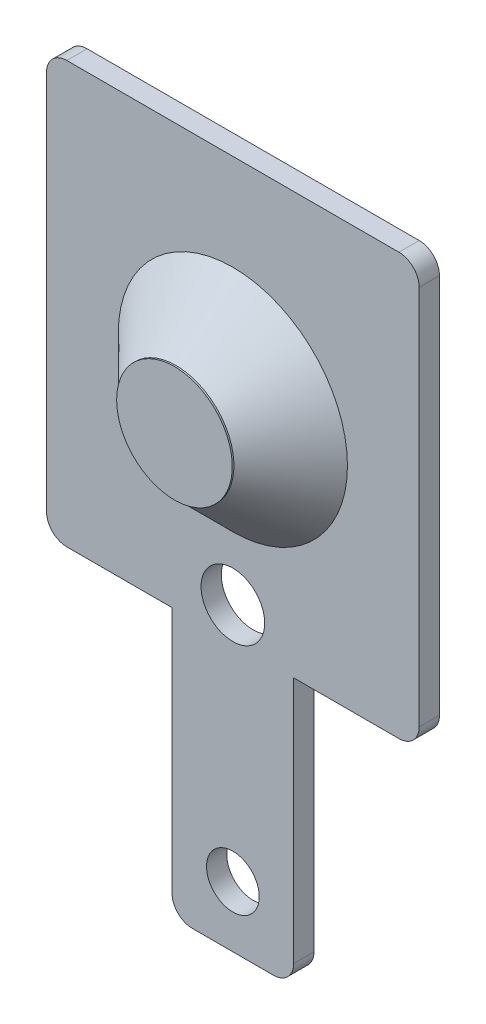
ISO-10303-21;
HEADER;
FILE_DESCRIPTION(('STEP AP214'),'2;1');
FILE_NAME('part.step','',(''),(''),'','','');
FILE_SCHEMA(('AUTOMOTIVE_DESIGN { 1 0 10303 214 1 1 1 1 }'));
ENDSEC;
DATA;
#1=APPLICATION_CONTEXT('core data for automotive mechanical design processes');
#2=APPLICATION_PROTOCOL_DEFINITION('international standard','automotive_design',2000,#1);
#3=PRODUCT_CONTEXT('',#1,'mechanical');
#4=PRODUCT('Part','Part','',(#3));
#5=PRODUCT_RELATED_PRODUCT_CATEGORY('part','',(#4));
#6=PRODUCT_DEFINITION_FORMATION('','',#4);
#7=PRODUCT_DEFINITION_CONTEXT('part definition',#1,'design');
#8=PRODUCT_DEFINITION('design','',#6,#7);
#9=PRODUCT_DEFINITION_SHAPE('','',#8);
#10=(LENGTH_UNIT() NAMED_UNIT(*) SI_UNIT(.MILLI.,.METRE.));
#11=(NAMED_UNIT(*) PLANE_ANGLE_UNIT() SI_UNIT($,.RADIAN.));
#12=(NAMED_UNIT(*) SI_UNIT($,.STERADIAN.) SOLID_ANGLE_UNIT());
#13=UNCERTAINTY_MEASURE_WITH_UNIT(LENGTH_MEASURE(1.E-05),#10,'distance_accuracy_value','');
#14=(GEOMETRIC_REPRESENTATION_CONTEXT(3) GLOBAL_UNCERTAINTY_ASSIGNED_CONTEXT((#13)) GLOBAL_UNIT_ASSIGNED_CONTEXT((#10,
#11,#12)) REPRESENTATION_CONTEXT('',''));
#15=CARTESIAN_POINT('',(0.,0.,0.));
#16=DIRECTION('',(0.,0.,1.));
#17=DIRECTION('',(1.,0.,0.));
#18=AXIS2_PLACEMENT_3D('',#15,#16,#17);
#19=CARTESIAN_POINT('',(0.,0.,0.5));
#20=DIRECTION('',(0.,0.,-1.));
#21=DIRECTION('',(-1.,0.,0.));
#22=AXIS2_PLACEMENT_3D('',#19,#20,#21);
#23=PLANE('',#22);
#24=CARTESIAN_POINT('',(4.595,-5.1943,0.5));
#25=DIRECTION('',(0.,0.,-1.));
#26=DIRECTION('',(-1.,0.,0.));
#27=AXIS2_PLACEMENT_3D('',#24,#25,#26);
#28=CIRCLE('',#27,2.82620679675844);
#29=CARTESIAN_POINT('',(1.76879320324156,-5.1943,0.5));
#30=VERTEX_POINT('',#29);
#31=EDGE_CURVE('E11',#30,#30,#28,.T.);
#32=ORIENTED_EDGE('',*,*,#31,.T.);
#33=EDGE_LOOP('',(#32));
#34=FACE_BOUND('',#33,.T.);
#35=DIRECTION('',(1.,0.,0.));
#36=VECTOR('',#35,1.);
#37=CARTESIAN_POINT('',(6.095,-10.3886,0.5));
#38=LINE('',#37,#36);
#39=CARTESIAN_POINT('',(6.095,-10.3886,0.5));
#40=VERTEX_POINT('',#39);
#41=CARTESIAN_POINT('',(8.69,-10.3886,0.5));
#42=VERTEX_POINT('',#41);
#43=EDGE_CURVE('E174',#40,#42,#38,.T.);
#44=ORIENTED_EDGE('',*,*,#43,.T.);
#45=CARTESIAN_POINT('',(8.69,-9.8886,0.5));
#46=DIRECTION('',(0.,0.,-1.));
#47=DIRECTION('',(-1.,0.,0.));
#48=AXIS2_PLACEMENT_3D('',#45,#46,#47);
#49=CIRCLE('',#48,0.5);
#50=CARTESIAN_POINT('',(9.19,-9.88859999999999,0.5));
#51=VERTEX_POINT('',#50);
#52=EDGE_CURVE('E228',#42,#51,#49,.F.);
#53=ORIENTED_EDGE('',*,*,#52,.T.);
#54=DIRECTION('',(0.,1.,0.));
#55=VECTOR('',#54,1.);
#56=CARTESIAN_POINT('',(9.19,0.,0.5));
#57=LINE('',#56,#55);
#58=CARTESIAN_POINT('',(9.19,-0.5,0.5));
#59=VERTEX_POINT('',#58);
#60=EDGE_CURVE('E176',#51,#59,#57,.T.);
#61=ORIENTED_EDGE('',*,*,#60,.T.);
#62=CARTESIAN_POINT('',(8.69,-0.5,0.5));
#63=DIRECTION('',(0.,0.,-1.));
#64=DIRECTION('',(-1.,0.,0.));
#65=AXIS2_PLACEMENT_3D('',#62,#63,#64);
#66=CIRCLE('',#65,0.5);
#67=CARTESIAN_POINT('',(8.69,0.,0.5));
#68=VERTEX_POINT('',#67);
#69=EDGE_CURVE('E57',#59,#68,#66,.F.);
#70=ORIENTED_EDGE('',*,*,#69,.T.);
#71=DIRECTION('',(-1.,0.,0.));
#72=VECTOR('',#71,1.);
#73=CARTESIAN_POINT('',(0.,0.,0.5));
#74=LINE('',#73,#72);
#75=CARTESIAN_POINT('',(0.5,0.,0.5));
#76=VERTEX_POINT('',#75);
#77=EDGE_CURVE('E178',#68,#76,#74,.T.);
#78=ORIENTED_EDGE('',*,*,#77,.T.);
#79=CARTESIAN_POINT('',(0.5,-0.5,0.5));
#80=DIRECTION('',(0.,0.,-1.));
#81=DIRECTION('',(-1.,0.,0.));
#82=AXIS2_PLACEMENT_3D('',#79,#80,#81);
#83=CIRCLE('',#82,0.5);
#84=CARTESIAN_POINT('',(0.,-0.500000000000004,0.5));
#85=VERTEX_POINT('',#84);
#86=EDGE_CURVE('E226',#76,#85,#83,.F.);
#87=ORIENTED_EDGE('',*,*,#86,.T.);
#88=DIRECTION('',(0.,-1.,0.));
#89=VECTOR('',#88,1.);
#90=CARTESIAN_POINT('',(0.,-10.3886,0.5));
#91=LINE('',#90,#89);
#92=CARTESIAN_POINT('',(0.,-9.8886,0.5));
#93=VERTEX_POINT('',#92);
#94=EDGE_CURVE('E150',#85,#93,#91,.T.);
#95=ORIENTED_EDGE('',*,*,#94,.T.);
#96=CARTESIAN_POINT('',(0.5,-9.8886,0.5));
#97=DIRECTION('',(0.,0.,-1.));
#98=DIRECTION('',(-1.,0.,0.));
#99=AXIS2_PLACEMENT_3D('',#96,#97,#98);
#100=CIRCLE('',#99,0.5);
#101=CARTESIAN_POINT('',(0.5,-10.3886,0.5));
#102=VERTEX_POINT('',#101);
#103=EDGE_CURVE('E146',#93,#102,#100,.F.);
#104=ORIENTED_EDGE('',*,*,#103,.T.);
#105=DIRECTION('',(1.,0.,0.));
#106=VECTOR('',#105,1.);
#107=CARTESIAN_POINT('',(0.,-10.3886,0.5));
#108=LINE('',#107,#106);
#109=CARTESIAN_POINT('',(3.095,-10.3886,0.5));
#110=VERTEX_POINT('',#109);
#111=EDGE_CURVE('E137',#102,#110,#108,.T.);
#112=ORIENTED_EDGE('',*,*,#111,.T.);
#113=DIRECTION('',(0.,-1.,0.));
#114=VECTOR('',#113,1.);
#115=CARTESIAN_POINT('',(3.095,-10.3886,0.5));
#116=LINE('',#115,#114);
#117=CARTESIAN_POINT('',(3.095,-16.49,0.5));
#118=VERTEX_POINT('',#117);
#119=EDGE_CURVE('E142',#110,#118,#116,.T.);
#120=ORIENTED_EDGE('',*,*,#119,.T.);
#121=CARTESIAN_POINT('',(3.595,-16.49,0.5));
#122=DIRECTION('',(0.,0.,-1.));
#123=DIRECTION('',(-1.,0.,0.));
#124=AXIS2_PLACEMENT_3D('',#121,#122,#123);
#125=CIRCLE('',#124,0.5);
#126=CARTESIAN_POINT('',(3.595,-16.99,0.5));
#127=VERTEX_POINT('',#126);
#128=EDGE_CURVE('E221',#118,#127,#125,.F.);
#129=ORIENTED_EDGE('',*,*,#128,.T.);
#130=DIRECTION('',(1.,0.,0.));
#131=VECTOR('',#130,1.);
#132=CARTESIAN_POINT('',(3.095,-16.99,0.5));
#133=LINE('',#132,#131);
#134=CARTESIAN_POINT('',(5.595,-16.99,0.5));
#135=VERTEX_POINT('',#134);
#136=EDGE_CURVE('E166',#127,#135,#133,.T.);
#137=ORIENTED_EDGE('',*,*,#136,.T.);
#138=CARTESIAN_POINT('',(5.595,-16.49,0.5));
#139=DIRECTION('',(0.,0.,-1.));
#140=DIRECTION('',(-1.,0.,0.));
#141=AXIS2_PLACEMENT_3D('',#138,#139,#140);
#142=CIRCLE('',#141,0.5);
#143=CARTESIAN_POINT('',(6.095,-16.49,0.5));
#144=VERTEX_POINT('',#143);
#145=EDGE_CURVE('E223',#135,#144,#142,.F.);
#146=ORIENTED_EDGE('',*,*,#145,.T.);
#147=DIRECTION('',(0.,1.,0.));
#148=VECTOR('',#147,1.);
#149=CARTESIAN_POINT('',(6.095,-16.99,0.5));
#150=LINE('',#149,#148);
#151=EDGE_CURVE('E169',#144,#40,#150,.T.);
#152=ORIENTED_EDGE('',*,*,#151,.T.);
#153=EDGE_LOOP('',(#44,#53,#61,#70,#78,#87,#95,#104,#112,#120,#129,#137,#146,#152));
#154=FACE_BOUND('',#153,.T.);
#155=CARTESIAN_POINT('',(4.595,-15.49,0.5));
#156=DIRECTION('',(0.,0.,1.));
#157=DIRECTION('',(1.,0.,0.));
#158=AXIS2_PLACEMENT_3D('',#155,#156,#157);
#159=CIRCLE('',#158,0.65);
#160=CARTESIAN_POINT('',(5.245,-15.49,0.5));
#161=VERTEX_POINT('',#160);
#162=EDGE_CURVE('E183',#161,#161,#159,.T.);
#163=ORIENTED_EDGE('',*,*,#162,.F.);
#164=EDGE_LOOP('',(#163));
#165=FACE_BOUND('',#164,.T.);
#166=CARTESIAN_POINT('',(4.595,-9.5786,0.5));
#167=DIRECTION('',(0.,0.,1.));
#168=DIRECTION('',(1.,0.,0.));
#169=AXIS2_PLACEMENT_3D('',#166,#167,#168);
#170=CIRCLE('',#169,0.784999999999999);
#171=CARTESIAN_POINT('',(5.38,-9.5786,0.5));
#172=VERTEX_POINT('',#171);
#173=EDGE_CURVE('E361',#172,#172,#170,.T.);
#174=ORIENTED_EDGE('',*,*,#173,.F.);
#175=EDGE_LOOP('',(#174));
#176=FACE_BOUND('',#175,.T.);
#177=ADVANCED_FACE('F35',(#34,#154,#165,#176),#23,.F.);
#178=CARTESIAN_POINT('',(0.,0.,0.));
#179=DIRECTION('',(0.,0.,-1.));
#180=DIRECTION('',(-1.,0.,0.));
#181=AXIS2_PLACEMENT_3D('',#178,#179,#180);
#182=PLANE('',#181);
#183=CARTESIAN_POINT('',(4.595,-15.49,0.));
#184=DIRECTION('',(0.,0.,1.));
#185=DIRECTION('',(1.,0.,0.));
#186=AXIS2_PLACEMENT_3D('',#183,#184,#185);
#187=CIRCLE('',#186,0.65);
#188=CARTESIAN_POINT('',(5.245,-15.49,0.));
#189=VERTEX_POINT('',#188);
#190=EDGE_CURVE('E358',#189,#189,#187,.T.);
#191=ORIENTED_EDGE('',*,*,#190,.T.);
#192=EDGE_LOOP('',(#191));
#193=FACE_BOUND('',#192,.T.);
#194=DIRECTION('',(0.,1.,0.));
#195=VECTOR('',#194,1.);
#196=CARTESIAN_POINT('',(9.19,0.,0.));
#197=LINE('',#196,#195);
#198=CARTESIAN_POINT('',(9.19,-9.88859999999999,0.));
#199=VERTEX_POINT('',#198);
#200=CARTESIAN_POINT('',(9.19,-0.5,0.));
#201=VERTEX_POINT('',#200);
#202=EDGE_CURVE('E195',#199,#201,#197,.T.);
#203=ORIENTED_EDGE('',*,*,#202,.F.);
#204=CARTESIAN_POINT('',(8.69,-9.8886,0.));
#205=DIRECTION('',(0.,0.,-1.));
#206=DIRECTION('',(-1.,0.,0.));
#207=AXIS2_PLACEMENT_3D('',#204,#205,#206);
#208=CIRCLE('',#207,0.5);
#209=CARTESIAN_POINT('',(8.69,-10.3886,0.));
#210=VERTEX_POINT('',#209);
#211=EDGE_CURVE('E216',#199,#210,#208,.T.);
#212=ORIENTED_EDGE('',*,*,#211,.T.);
#213=DIRECTION('',(1.,0.,0.));
#214=VECTOR('',#213,1.);
#215=CARTESIAN_POINT('',(6.095,-10.3886,0.));
#216=LINE('',#215,#214);
#217=CARTESIAN_POINT('',(6.095,-10.3886,0.));
#218=VERTEX_POINT('',#217);
#219=EDGE_CURVE('E192',#218,#210,#216,.T.);
#220=ORIENTED_EDGE('',*,*,#219,.F.);
#221=DIRECTION('',(0.,1.,0.));
#222=VECTOR('',#221,1.);
#223=CARTESIAN_POINT('',(6.095,-16.99,0.));
#224=LINE('',#223,#222);
#225=CARTESIAN_POINT('',(6.095,-16.49,0.));
#226=VERTEX_POINT('',#225);
#227=EDGE_CURVE('E190',#226,#218,#224,.T.);
#228=ORIENTED_EDGE('',*,*,#227,.F.);
#229=CARTESIAN_POINT('',(5.595,-16.49,0.));
#230=DIRECTION('',(0.,0.,-1.));
#231=DIRECTION('',(-1.,0.,0.));
#232=AXIS2_PLACEMENT_3D('',#229,#230,#231);
#233=CIRCLE('',#232,0.5);
#234=CARTESIAN_POINT('',(5.595,-16.99,0.));
#235=VERTEX_POINT('',#234);
#236=EDGE_CURVE('E210',#226,#235,#233,.T.);
#237=ORIENTED_EDGE('',*,*,#236,.T.);
#238=DIRECTION('',(1.,0.,0.));
#239=VECTOR('',#238,1.);
#240=CARTESIAN_POINT('',(3.095,-16.99,0.));
#241=LINE('',#240,#239);
#242=CARTESIAN_POINT('',(3.595,-16.99,0.));
#243=VERTEX_POINT('',#242);
#244=EDGE_CURVE('E187',#243,#235,#241,.T.);
#245=ORIENTED_EDGE('',*,*,#244,.F.);
#246=CARTESIAN_POINT('',(3.595,-16.49,0.));
#247=DIRECTION('',(0.,0.,-1.));
#248=DIRECTION('',(-1.,0.,0.));
#249=AXIS2_PLACEMENT_3D('',#246,#247,#248);
#250=CIRCLE('',#249,0.5);
#251=CARTESIAN_POINT('',(3.095,-16.49,0.));
#252=VERTEX_POINT('',#251);
#253=EDGE_CURVE('E208',#243,#252,#250,.T.);
#254=ORIENTED_EDGE('',*,*,#253,.T.);
#255=DIRECTION('',(0.,-1.,0.));
#256=VECTOR('',#255,1.);
#257=CARTESIAN_POINT('',(3.095,-10.3886,0.));
#258=LINE('',#257,#256);
#259=CARTESIAN_POINT('',(3.095,-10.3886,0.));
#260=VERTEX_POINT('',#259);
#261=EDGE_CURVE('E185',#260,#252,#258,.T.);
#262=ORIENTED_EDGE('',*,*,#261,.F.);
#263=DIRECTION('',(1.,0.,0.));
#264=VECTOR('',#263,1.);
#265=CARTESIAN_POINT('',(0.,-10.3886,0.));
#266=LINE('',#265,#264);
#267=CARTESIAN_POINT('',(0.5,-10.3886,0.));
#268=VERTEX_POINT('',#267);
#269=EDGE_CURVE('E156',#268,#260,#266,.T.);
#270=ORIENTED_EDGE('',*,*,#269,.F.);
#271=CARTESIAN_POINT('',(0.5,-9.8886,0.));
#272=DIRECTION('',(0.,0.,-1.));
#273=DIRECTION('',(-1.,0.,0.));
#274=AXIS2_PLACEMENT_3D('',#271,#272,#273);
#275=CIRCLE('',#274,0.5);
#276=CARTESIAN_POINT('',(0.,-9.8886,0.));
#277=VERTEX_POINT('',#276);
#278=EDGE_CURVE('E206',#268,#277,#275,.T.);
#279=ORIENTED_EDGE('',*,*,#278,.T.);
#280=DIRECTION('',(0.,-1.,0.));
#281=VECTOR('',#280,1.);
#282=CARTESIAN_POINT('',(0.,-10.3886,0.));
#283=LINE('',#282,#281);
#284=CARTESIAN_POINT('',(0.,-0.500000000000004,0.));
#285=VERTEX_POINT('',#284);
#286=EDGE_CURVE('E180',#285,#277,#283,.T.);
#287=ORIENTED_EDGE('',*,*,#286,.F.);
#288=CARTESIAN_POINT('',(0.5,-0.5,0.));
#289=DIRECTION('',(0.,0.,-1.));
#290=DIRECTION('',(-1.,0.,0.));
#291=AXIS2_PLACEMENT_3D('',#288,#289,#290);
#292=CIRCLE('',#291,0.5);
#293=CARTESIAN_POINT('',(0.5,0.,0.));
#294=VERTEX_POINT('',#293);
#295=EDGE_CURVE('E214',#285,#294,#292,.T.);
#296=ORIENTED_EDGE('',*,*,#295,.T.);
#297=DIRECTION('',(-1.,0.,0.));
#298=VECTOR('',#297,1.);
#299=CARTESIAN_POINT('',(0.,0.,0.));
#300=LINE('',#299,#298);
#301=CARTESIAN_POINT('',(8.69,0.,0.));
#302=VERTEX_POINT('',#301);
#303=EDGE_CURVE('E198',#302,#294,#300,.T.);
#304=ORIENTED_EDGE('',*,*,#303,.F.);
#305=CARTESIAN_POINT('',(8.69,-0.5,0.));
#306=DIRECTION('',(0.,0.,-1.));
#307=DIRECTION('',(-1.,0.,0.));
#308=AXIS2_PLACEMENT_3D('',#305,#306,#307);
#309=CIRCLE('',#308,0.5);
#310=EDGE_CURVE('E212',#302,#201,#309,.T.);
#311=ORIENTED_EDGE('',*,*,#310,.T.);
#312=EDGE_LOOP('',(#203,#212,#220,#228,#237,#245,#254,#262,#270,#279,#287,#296,#304,#311));
#313=FACE_BOUND('',#312,.T.);
#314=CARTESIAN_POINT('',(4.595,-9.5786,0.));
#315=DIRECTION('',(0.,0.,1.));
#316=DIRECTION('',(1.,0.,0.));
#317=AXIS2_PLACEMENT_3D('',#314,#315,#316);
#318=CIRCLE('',#317,0.784999999999999);
#319=CARTESIAN_POINT('',(5.38,-9.5786,0.));
#320=VERTEX_POINT('',#319);
#321=EDGE_CURVE('E364',#320,#320,#318,.T.);
#322=ORIENTED_EDGE('',*,*,#321,.T.);
#323=EDGE_LOOP('',(#322));
#324=FACE_BOUND('',#323,.T.);
#325=ADVANCED_FACE('F265',(#193,#313,#324),#182,.T.);
#326=CARTESIAN_POINT('',(0.,-10.3886,0.5));
#327=DIRECTION('',(1.,0.,0.));
#328=DIRECTION('',(0.,1.,0.));
#329=AXIS2_PLACEMENT_3D('',#326,#327,#328);
#330=PLANE('',#329);
#331=ORIENTED_EDGE('',*,*,#94,.F.);
#332=DIRECTION('',(0.,0.,-1.));
#333=VECTOR('',#332,1.);
#334=CARTESIAN_POINT('',(0.,-0.5,0.5));
#335=LINE('',#334,#333);
#336=EDGE_CURVE('E232',#85,#285,#335,.T.);
#337=ORIENTED_EDGE('',*,*,#336,.T.);
#338=ORIENTED_EDGE('',*,*,#286,.T.);
#339=DIRECTION('',(0.,0.,-1.));
#340=VECTOR('',#339,1.);
#341=CARTESIAN_POINT('',(0.,-9.8886,0.5));
#342=LINE('',#341,#340);
#343=EDGE_CURVE('E230',#277,#93,#342,.F.);
#344=ORIENTED_EDGE('',*,*,#343,.T.);
#345=EDGE_LOOP('',(#331,#337,#338,#344));
#346=FACE_BOUND('',#345,.T.);
#347=ADVANCED_FACE('F271',(#346),#330,.F.);
#348=CARTESIAN_POINT('',(0.,-10.3886,0.5));
#349=DIRECTION('',(0.,1.,0.));
#350=DIRECTION('',(0.,0.,1.));
#351=AXIS2_PLACEMENT_3D('',#348,#349,#350);
#352=PLANE('',#351);
#353=ORIENTED_EDGE('',*,*,#111,.F.);
#354=DIRECTION('',(0.,0.,-1.));
#355=VECTOR('',#354,1.);
#356=CARTESIAN_POINT('',(0.5,-10.3886,0.5));
#357=LINE('',#356,#355);
#358=EDGE_CURVE('E248',#102,#268,#357,.T.);
#359=ORIENTED_EDGE('',*,*,#358,.T.);
#360=ORIENTED_EDGE('',*,*,#269,.T.);
#361=DIRECTION('',(0.,0.,-1.));
#362=VECTOR('',#361,1.);
#363=CARTESIAN_POINT('',(3.095,-10.3886,0.5));
#364=LINE('',#363,#362);
#365=EDGE_CURVE('E153',#110,#260,#364,.T.);
#366=ORIENTED_EDGE('',*,*,#365,.F.);
#367=EDGE_LOOP('',(#353,#359,#360,#366));
#368=FACE_BOUND('',#367,.T.);
#369=ADVANCED_FACE('F154',(#368),#352,.F.);
#370=CARTESIAN_POINT('',(3.095,-10.3886,0.5));
#371=DIRECTION('',(1.,0.,0.));
#372=DIRECTION('',(0.,1.,0.));
#373=AXIS2_PLACEMENT_3D('',#370,#371,#372);
#374=PLANE('',#373);
#375=ORIENTED_EDGE('',*,*,#261,.T.);
#376=DIRECTION('',(0.,0.,-1.));
#377=VECTOR('',#376,1.);
#378=CARTESIAN_POINT('',(3.095,-16.49,0.5));
#379=LINE('',#378,#377);
#380=EDGE_CURVE('E165',#252,#118,#379,.F.);
#381=ORIENTED_EDGE('',*,*,#380,.T.);
#382=ORIENTED_EDGE('',*,*,#119,.F.);
#383=ORIENTED_EDGE('',*,*,#365,.T.);
#384=EDGE_LOOP('',(#375,#381,#382,#383));
#385=FACE_BOUND('',#384,.T.);
#386=ADVANCED_FACE('F163',(#385),#374,.F.);
#387=CARTESIAN_POINT('',(3.095,-16.99,0.5));
#388=DIRECTION('',(0.,1.,0.));
#389=DIRECTION('',(0.,0.,1.));
#390=AXIS2_PLACEMENT_3D('',#387,#388,#389);
#391=PLANE('',#390);
#392=ORIENTED_EDGE('',*,*,#244,.T.);
#393=DIRECTION('',(0.,0.,-1.));
#394=VECTOR('',#393,1.);
#395=CARTESIAN_POINT('',(5.595,-16.99,0.5));
#396=LINE('',#395,#394);
#397=EDGE_CURVE('E245',#235,#135,#396,.F.);
#398=ORIENTED_EDGE('',*,*,#397,.T.);
#399=ORIENTED_EDGE('',*,*,#136,.F.);
#400=DIRECTION('',(0.,0.,-1.));
#401=VECTOR('',#400,1.);
#402=CARTESIAN_POINT('',(3.595,-16.99,0.5));
#403=LINE('',#402,#401);
#404=EDGE_CURVE('E242',#127,#243,#403,.T.);
#405=ORIENTED_EDGE('',*,*,#404,.T.);
#406=EDGE_LOOP('',(#392,#398,#399,#405));
#407=FACE_BOUND('',#406,.T.);
#408=ADVANCED_FACE('F292',(#407),#391,.F.);
#409=CARTESIAN_POINT('',(6.095,-16.99,0.5));
#410=DIRECTION('',(-1.,0.,0.));
#411=DIRECTION('',(0.,0.,1.));
#412=AXIS2_PLACEMENT_3D('',#409,#410,#411);
#413=PLANE('',#412);
#414=ORIENTED_EDGE('',*,*,#151,.F.);
#415=DIRECTION('',(0.,0.,-1.));
#416=VECTOR('',#415,1.);
#417=CARTESIAN_POINT('',(6.095,-16.49,0.5));
#418=LINE('',#417,#416);
#419=EDGE_CURVE('E239',#144,#226,#418,.T.);
#420=ORIENTED_EDGE('',*,*,#419,.T.);
#421=ORIENTED_EDGE('',*,*,#227,.T.);
#422=DIRECTION('',(0.,0.,-1.));
#423=VECTOR('',#422,1.);
#424=CARTESIAN_POINT('',(6.095,-10.3886,0.5));
#425=LINE('',#424,#423);
#426=EDGE_CURVE('E161',#40,#218,#425,.T.);
#427=ORIENTED_EDGE('',*,*,#426,.F.);
#428=EDGE_LOOP('',(#414,#420,#421,#427));
#429=FACE_BOUND('',#428,.T.);
#430=ADVANCED_FACE('F288',(#429),#413,.F.);
#431=CARTESIAN_POINT('',(6.095,-10.3886,0.5));
#432=DIRECTION('',(0.,1.,0.));
#433=DIRECTION('',(0.,0.,1.));
#434=AXIS2_PLACEMENT_3D('',#431,#432,#433);
#435=PLANE('',#434);
#436=ORIENTED_EDGE('',*,*,#219,.T.);
#437=DIRECTION('',(0.,0.,-1.));
#438=VECTOR('',#437,1.);
#439=CARTESIAN_POINT('',(8.69,-10.3886,0.5));
#440=LINE('',#439,#438);
#441=EDGE_CURVE('E218',#210,#42,#440,.F.);
#442=ORIENTED_EDGE('',*,*,#441,.T.);
#443=ORIENTED_EDGE('',*,*,#43,.F.);
#444=ORIENTED_EDGE('',*,*,#426,.T.);
#445=EDGE_LOOP('',(#436,#442,#443,#444));
#446=FACE_BOUND('',#445,.T.);
#447=ADVANCED_FACE('F284',(#446),#435,.F.);
#448=CARTESIAN_POINT('',(9.19,0.,0.5));
#449=DIRECTION('',(-1.,0.,0.));
#450=DIRECTION('',(0.,-1.,0.));
#451=AXIS2_PLACEMENT_3D('',#448,#449,#450);
#452=PLANE('',#451);
#453=ORIENTED_EDGE('',*,*,#60,.F.);
#454=DIRECTION('',(0.,0.,-1.));
#455=VECTOR('',#454,1.);
#456=CARTESIAN_POINT('',(9.19,-9.8886,0.5));
#457=LINE('',#456,#455);
#458=EDGE_CURVE('E203',#51,#199,#457,.T.);
#459=ORIENTED_EDGE('',*,*,#458,.T.);
#460=ORIENTED_EDGE('',*,*,#202,.T.);
#461=DIRECTION('',(0.,0.,-1.));
#462=VECTOR('',#461,1.);
#463=CARTESIAN_POINT('',(9.19,-0.5,0.5));
#464=LINE('',#463,#462);
#465=EDGE_CURVE('E160',#201,#59,#464,.F.);
#466=ORIENTED_EDGE('',*,*,#465,.T.);
#467=EDGE_LOOP('',(#453,#459,#460,#466));
#468=FACE_BOUND('',#467,.T.);
#469=ADVANCED_FACE('F281',(#468),#452,.F.);
#470=CARTESIAN_POINT('',(0.,0.,0.5));
#471=DIRECTION('',(0.,-1.,0.));
#472=DIRECTION('',(0.,0.,-1.));
#473=AXIS2_PLACEMENT_3D('',#470,#471,#472);
#474=PLANE('',#473);
#475=ORIENTED_EDGE('',*,*,#303,.T.);
#476=DIRECTION('',(0.,0.,-1.));
#477=VECTOR('',#476,1.);
#478=CARTESIAN_POINT('',(0.5,0.,0.5));
#479=LINE('',#478,#477);
#480=EDGE_CURVE('E50',#294,#76,#479,.F.);
#481=ORIENTED_EDGE('',*,*,#480,.T.);
#482=ORIENTED_EDGE('',*,*,#77,.F.);
#483=DIRECTION('',(0.,0.,-1.));
#484=VECTOR('',#483,1.);
#485=CARTESIAN_POINT('',(8.69,0.,0.5));
#486=LINE('',#485,#484);
#487=EDGE_CURVE('E235',#68,#302,#486,.T.);
#488=ORIENTED_EDGE('',*,*,#487,.T.);
#489=EDGE_LOOP('',(#475,#481,#482,#488));
#490=FACE_BOUND('',#489,.T.);
#491=ADVANCED_FACE('F278',(#490),#474,.F.);
#492=CARTESIAN_POINT('',(4.595,-15.49,0.5));
#493=DIRECTION('',(0.,0.,-1.));
#494=DIRECTION('',(-1.,0.,0.));
#495=AXIS2_PLACEMENT_3D('',#492,#493,#494);
#496=CYLINDRICAL_SURFACE('',#495,0.65);
#497=ORIENTED_EDGE('',*,*,#162,.T.);
#498=EDGE_LOOP('',(#497));
#499=FACE_BOUND('',#498,.T.);
#500=ORIENTED_EDGE('',*,*,#190,.F.);
#501=EDGE_LOOP('',(#500));
#502=FACE_BOUND('',#501,.T.);
#503=ADVANCED_FACE('F275',(#499,#502),#496,.F.);
#504=CARTESIAN_POINT('',(4.595,-9.5786,0.5));
#505=DIRECTION('',(0.,0.,-1.));
#506=DIRECTION('',(-1.,0.,0.));
#507=AXIS2_PLACEMENT_3D('',#504,#505,#506);
#508=CYLINDRICAL_SURFACE('',#507,0.784999999999999);
#509=ORIENTED_EDGE('',*,*,#173,.T.);
#510=EDGE_LOOP('',(#509));
#511=FACE_BOUND('',#510,.T.);
#512=ORIENTED_EDGE('',*,*,#321,.F.);
#513=EDGE_LOOP('',(#512));
#514=FACE_BOUND('',#513,.T.);
#515=ADVANCED_FACE('F308',(#511,#514),#508,.F.);
#516=CARTESIAN_POINT('',(8.69,-9.8886,0.5));
#517=DIRECTION('',(0.,0.,-1.));
#518=DIRECTION('',(-1.,0.,0.));
#519=AXIS2_PLACEMENT_3D('',#516,#517,#518);
#520=CYLINDRICAL_SURFACE('',#519,0.5);
#521=ORIENTED_EDGE('',*,*,#52,.F.);
#522=ORIENTED_EDGE('',*,*,#441,.F.);
#523=ORIENTED_EDGE('',*,*,#211,.F.);
#524=ORIENTED_EDGE('',*,*,#458,.F.);
#525=EDGE_LOOP('',(#521,#522,#523,#524));
#526=FACE_BOUND('',#525,.T.);
#527=ADVANCED_FACE('F304',(#526),#520,.T.);
#528=CARTESIAN_POINT('',(0.5,-0.5,0.5));
#529=DIRECTION('',(0.,0.,-1.));
#530=DIRECTION('',(-1.,0.,0.));
#531=AXIS2_PLACEMENT_3D('',#528,#529,#530);
#532=CYLINDRICAL_SURFACE('',#531,0.5);
#533=ORIENTED_EDGE('',*,*,#86,.F.);
#534=ORIENTED_EDGE('',*,*,#480,.F.);
#535=ORIENTED_EDGE('',*,*,#295,.F.);
#536=ORIENTED_EDGE('',*,*,#336,.F.);
#537=EDGE_LOOP('',(#533,#534,#535,#536));
#538=FACE_BOUND('',#537,.T.);
#539=ADVANCED_FACE('F307',(#538),#532,.T.);
#540=CARTESIAN_POINT('',(8.69,-0.5,0.5));
#541=DIRECTION('',(0.,0.,-1.));
#542=DIRECTION('',(-1.,0.,0.));
#543=AXIS2_PLACEMENT_3D('',#540,#541,#542);
#544=CYLINDRICAL_SURFACE('',#543,0.5);
#545=ORIENTED_EDGE('',*,*,#69,.F.);
#546=ORIENTED_EDGE('',*,*,#465,.F.);
#547=ORIENTED_EDGE('',*,*,#310,.F.);
#548=ORIENTED_EDGE('',*,*,#487,.F.);
#549=EDGE_LOOP('',(#545,#546,#547,#548));
#550=FACE_BOUND('',#549,.T.);
#551=ADVANCED_FACE('F312',(#550),#544,.T.);
#552=CARTESIAN_POINT('',(5.595,-16.49,0.5));
#553=DIRECTION('',(0.,0.,-1.));
#554=DIRECTION('',(-1.,0.,0.));
#555=AXIS2_PLACEMENT_3D('',#552,#553,#554);
#556=CYLINDRICAL_SURFACE('',#555,0.5);
#557=ORIENTED_EDGE('',*,*,#145,.F.);
#558=ORIENTED_EDGE('',*,*,#397,.F.);
#559=ORIENTED_EDGE('',*,*,#236,.F.);
#560=ORIENTED_EDGE('',*,*,#419,.F.);
#561=EDGE_LOOP('',(#557,#558,#559,#560));
#562=FACE_BOUND('',#561,.T.);
#563=ADVANCED_FACE('F316',(#562),#556,.T.);
#564=CARTESIAN_POINT('',(3.595,-16.49,0.5));
#565=DIRECTION('',(0.,0.,-1.));
#566=DIRECTION('',(-1.,0.,0.));
#567=AXIS2_PLACEMENT_3D('',#564,#565,#566);
#568=CYLINDRICAL_SURFACE('',#567,0.5);
#569=ORIENTED_EDGE('',*,*,#128,.F.);
#570=ORIENTED_EDGE('',*,*,#380,.F.);
#571=ORIENTED_EDGE('',*,*,#253,.F.);
#572=ORIENTED_EDGE('',*,*,#404,.F.);
#573=EDGE_LOOP('',(#569,#570,#571,#572));
#574=FACE_BOUND('',#573,.T.);
#575=ADVANCED_FACE('F320',(#574),#568,.T.);
#576=CARTESIAN_POINT('',(0.5,-9.8886,0.5));
#577=DIRECTION('',(0.,0.,-1.));
#578=DIRECTION('',(-1.,0.,0.));
#579=AXIS2_PLACEMENT_3D('',#576,#577,#578);
#580=CYLINDRICAL_SURFACE('',#579,0.5);
#581=ORIENTED_EDGE('',*,*,#103,.F.);
#582=ORIENTED_EDGE('',*,*,#343,.F.);
#583=ORIENTED_EDGE('',*,*,#278,.F.);
#584=ORIENTED_EDGE('',*,*,#358,.F.);
#585=EDGE_LOOP('',(#581,#582,#583,#584));
#586=FACE_BOUND('',#585,.T.);
#587=ADVANCED_FACE('F323',(#586),#580,.T.);
#588=CARTESIAN_POINT('',(4.595,-5.1943,1.94));
#589=DIRECTION('',(0.,0.,-1.));
#590=DIRECTION('',(-1.,0.,0.));
#591=AXIS2_PLACEMENT_3D('',#588,#589,#590);
#592=CYLINDRICAL_SURFACE('',#591,1.42620679675844);
#593=CARTESIAN_POINT('',(4.595,-5.1943,1.90000000000001));
#594=DIRECTION('',(0.,0.,-1.));
#595=DIRECTION('',(-1.,0.,0.));
#596=AXIS2_PLACEMENT_3D('',#593,#594,#595);
#597=CIRCLE('',#596,1.42620679675844);
#598=CARTESIAN_POINT('',(3.16879320324156,-5.1943,1.90000000000001));
#599=VERTEX_POINT('',#598);
#600=EDGE_CURVE('E43',#599,#599,#597,.F.);
#601=CARTESIAN_POINT('',(4.595,-5.1943,1.94));
#602=DIRECTION('',(0.,0.,1.));
#603=DIRECTION('',(1.,0.,0.));
#604=AXIS2_PLACEMENT_3D('',#601,#602,#603);
#605=CIRCLE('',#604,1.42620679675844);
#606=CARTESIAN_POINT('',(3.16879320324156,-5.1943,1.94));
#607=VERTEX_POINT('',#606);
#608=EDGE_CURVE('E367',#607,#607,#605,.T.);
#609=CARTESIAN_POINT('',(3.16879320324156,-5.1943,1.90000000000001));
#610=CARTESIAN_POINT('',(3.16879320324156,-5.1943,1.90041666666668));
#611=CARTESIAN_POINT('',(3.16879320324156,-5.1943,1.90083333333334));
#612=CARTESIAN_POINT('',(3.16879320324156,-5.1943,1.90166666666668));
#613=CARTESIAN_POINT('',(3.16879320324156,-5.1943,1.90208333333334));
#614=CARTESIAN_POINT('',(3.16879320324156,-5.1943,1.90291666666668));
#615=CARTESIAN_POINT('',(3.16879320324156,-5.1943,1.90333333333334));
#616=CARTESIAN_POINT('',(3.16879320324156,-5.1943,1.90416666666668));
#617=CARTESIAN_POINT('',(3.16879320324156,-5.1943,1.90458333333334));
#618=CARTESIAN_POINT('',(3.16879320324156,-5.1943,1.90541666666668));
#619=CARTESIAN_POINT('',(3.16879320324156,-5.1943,1.90583333333334));
#620=CARTESIAN_POINT('',(3.16879320324156,-5.1943,1.90666666666668));
#621=CARTESIAN_POINT('',(3.16879320324156,-5.1943,1.90708333333334));
#622=CARTESIAN_POINT('',(3.16879320324156,-5.1943,1.90791666666668));
#623=CARTESIAN_POINT('',(3.16879320324156,-5.1943,1.90833333333334));
#624=CARTESIAN_POINT('',(3.16879320324156,-5.1943,1.90916666666668));
#625=CARTESIAN_POINT('',(3.16879320324156,-5.1943,1.90958333333334));
#626=CARTESIAN_POINT('',(3.16879320324156,-5.1943,1.91041666666668));
#627=CARTESIAN_POINT('',(3.16879320324156,-5.1943,1.91083333333334));
#628=CARTESIAN_POINT('',(3.16879320324156,-5.1943,1.91166666666668));
#629=CARTESIAN_POINT('',(3.16879320324156,-5.1943,1.91208333333334));
#630=CARTESIAN_POINT('',(3.16879320324156,-5.1943,1.91291666666667));
#631=CARTESIAN_POINT('',(3.16879320324156,-5.1943,1.91333333333334));
#632=CARTESIAN_POINT('',(3.16879320324156,-5.1943,1.91416666666667));
#633=CARTESIAN_POINT('',(3.16879320324156,-5.1943,1.91458333333334));
#634=CARTESIAN_POINT('',(3.16879320324156,-5.1943,1.91541666666667));
#635=CARTESIAN_POINT('',(3.16879320324156,-5.1943,1.91583333333334));
#636=CARTESIAN_POINT('',(3.16879320324156,-5.1943,1.91666666666667));
#637=CARTESIAN_POINT('',(3.16879320324156,-5.1943,1.91708333333334));
#638=CARTESIAN_POINT('',(3.16879320324156,-5.1943,1.91791666666667));
#639=CARTESIAN_POINT('',(3.16879320324156,-5.1943,1.91833333333334));
#640=CARTESIAN_POINT('',(3.16879320324156,-5.1943,1.91916666666667));
#641=CARTESIAN_POINT('',(3.16879320324156,-5.1943,1.91958333333334));
#642=CARTESIAN_POINT('',(3.16879320324156,-5.1943,1.92041666666667));
#643=CARTESIAN_POINT('',(3.16879320324156,-5.1943,1.92083333333334));
#644=CARTESIAN_POINT('',(3.16879320324156,-5.1943,1.92166666666667));
#645=CARTESIAN_POINT('',(3.16879320324156,-5.1943,1.92208333333334));
#646=CARTESIAN_POINT('',(3.16879320324156,-5.1943,1.92291666666667));
#647=CARTESIAN_POINT('',(3.16879320324156,-5.1943,1.92333333333334));
#648=CARTESIAN_POINT('',(3.16879320324156,-5.1943,1.92416666666667));
#649=CARTESIAN_POINT('',(3.16879320324156,-5.1943,1.92458333333334));
#650=CARTESIAN_POINT('',(3.16879320324156,-5.1943,1.92541666666667));
#651=CARTESIAN_POINT('',(3.16879320324156,-5.1943,1.92583333333334));
#652=CARTESIAN_POINT('',(3.16879320324156,-5.1943,1.92666666666667));
#653=CARTESIAN_POINT('',(3.16879320324156,-5.1943,1.92708333333334));
#654=CARTESIAN_POINT('',(3.16879320324156,-5.1943,1.92791666666667));
#655=CARTESIAN_POINT('',(3.16879320324156,-5.1943,1.92833333333334));
#656=CARTESIAN_POINT('',(3.16879320324156,-5.1943,1.92916666666667));
#657=CARTESIAN_POINT('',(3.16879320324156,-5.1943,1.92958333333334));
#658=CARTESIAN_POINT('',(3.16879320324156,-5.1943,1.93041666666667));
#659=CARTESIAN_POINT('',(3.16879320324156,-5.1943,1.93083333333334));
#660=CARTESIAN_POINT('',(3.16879320324156,-5.1943,1.93166666666667));
#661=CARTESIAN_POINT('',(3.16879320324156,-5.1943,1.93208333333334));
#662=CARTESIAN_POINT('',(3.16879320324156,-5.1943,1.93291666666667));
#663=CARTESIAN_POINT('',(3.16879320324156,-5.1943,1.93333333333334));
#664=CARTESIAN_POINT('',(3.16879320324156,-5.1943,1.93416666666667));
#665=CARTESIAN_POINT('',(3.16879320324156,-5.1943,1.93458333333333));
#666=CARTESIAN_POINT('',(3.16879320324156,-5.1943,1.93541666666667));
#667=CARTESIAN_POINT('',(3.16879320324156,-5.1943,1.93583333333333));
#668=CARTESIAN_POINT('',(3.16879320324156,-5.1943,1.93666666666667));
#669=CARTESIAN_POINT('',(3.16879320324156,-5.1943,1.93708333333333));
#670=CARTESIAN_POINT('',(3.16879320324156,-5.1943,1.93791666666667));
#671=CARTESIAN_POINT('',(3.16879320324156,-5.1943,1.93833333333333));
#672=CARTESIAN_POINT('',(3.16879320324156,-5.1943,1.93916666666667));
#673=CARTESIAN_POINT('',(3.16879320324156,-5.1943,1.93958333333333));
#674=CARTESIAN_POINT('',(3.16879320324156,-5.1943,1.94));
#675=B_SPLINE_CURVE_WITH_KNOTS('',3,(#609,#610,#611,#612,#613,#614,#615,#616,#617,#618,#619,
#620,#621,#622,#623,#624,#625,#626,#627,#628,#629,#630,#631,#632,#633,#634,#635,#636,#637,#638,
#639,#640,#641,#642,#643,#644,#645,#646,#647,#648,#649,#650,#651,#652,#653,#654,#655,#656,#657,
#658,#659,#660,#661,#662,#663,#664,#665,#666,#667,#668,#669,#670,#671,#672,#673,#674),
.UNSPECIFIED.,.F.,.F.,(4,2,2,2,2,2,2,2,2,2,2,2,2,2,2,2,2,2,2,2,2,2,2,2,2,2,2,2,2,2,2,2,4),(0.,
0.00124999999999973,0.00249999999999925,0.00374999999999898,0.0049999999999985,
0.00624999999999823,0.00749999999999774,0.00874999999999748,0.00999999999999699,
0.0112499999999967,0.0124999999999962,0.013749999999996,0.0149999999999955,0.0162499999999952,
0.0174999999999947,0.0187499999999945,0.019999999999994,0.0212499999999937,0.0224999999999932,
0.023749999999993,0.0249999999999925,0.0262499999999922,0.0274999999999917,0.0287499999999915,
0.029999999999991,0.0312499999999907,0.0324999999999904,0.03374999999999,0.0349999999999897,
0.0362499999999892,0.0374999999999889,0.0387499999999884,0.0399999999999882),.UNSPECIFIED.);
#676=EDGE_CURVE('BSEAM252',#599,#607,#675,.T.);
#677=ORIENTED_EDGE('',*,*,#600,.T.);
#678=ORIENTED_EDGE('',*,*,#608,.F.);
#679=ORIENTED_EDGE('',*,*,#676,.T.);
#680=ORIENTED_EDGE('',*,*,#676,.F.);
#681=EDGE_LOOP('',(#677,#679,#678,#680));
#682=FACE_BOUND('',#681,.T.);
#683=ADVANCED_FACE('F252',(#682),#592,.T.);
#684=CARTESIAN_POINT('',(4.595,-5.1943,1.94));
#685=DIRECTION('',(0.,0.,1.));
#686=DIRECTION('',(1.,0.,0.));
#687=AXIS2_PLACEMENT_3D('',#684,#685,#686);
#688=PLANE('',#687);
#689=ORIENTED_EDGE('',*,*,#608,.T.);
#690=EDGE_LOOP('',(#689));
#691=FACE_BOUND('',#690,.T.);
#692=ADVANCED_FACE('F256',(#691),#688,.T.);
#693=CARTESIAN_POINT('',(4.595,-5.1943,1.90000000000001));
#694=DIRECTION('',(0.,0.,-1.));
#695=DIRECTION('',(-1.,0.,0.));
#696=AXIS2_PLACEMENT_3D('',#693,#694,#695);
#697=CONICAL_SURFACE('',#696,1.42620679675844,0.785398163397444);
#698=ORIENTED_EDGE('',*,*,#31,.F.);
#699=EDGE_LOOP('',(#698));
#700=FACE_BOUND('',#699,.T.);
#701=ORIENTED_EDGE('',*,*,#600,.F.);
#702=EDGE_LOOP('',(#701));
#703=FACE_BOUND('',#702,.T.);
#704=ADVANCED_FACE('F37',(#700,#703),#697,.T.);
#705=CLOSED_SHELL('',(#177,#325,#347,#369,#386,#408,#430,#447,#469,#491,#503,#515,#527,#539,
#551,#563,#575,#587,#683,#692,#704));
#706=MANIFOLD_SOLID_BREP('B2',#705);
#707=ADVANCED_BREP_SHAPE_REPRESENTATION('',(#18,#706),#14);
#708=SHAPE_DEFINITION_REPRESENTATION(#9,#707);
ENDSEC;
END-ISO-10303-21;
